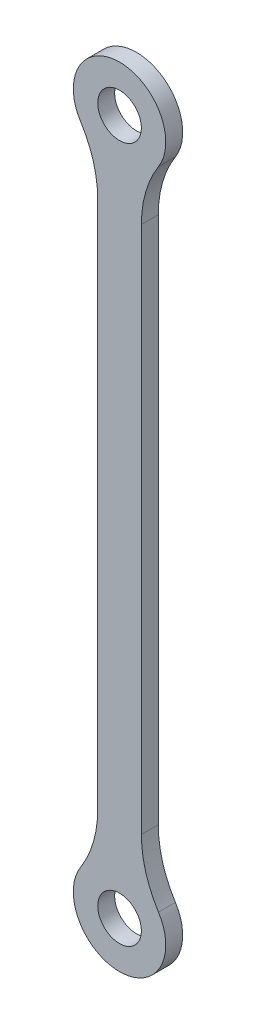
ISO-10303-21;
HEADER;
FILE_DESCRIPTION(('STEP AP214'),'2;1');
FILE_NAME('part.step','',(''),(''),'','','');
FILE_SCHEMA(('AUTOMOTIVE_DESIGN { 1 0 10303 214 1 1 1 1 }'));
ENDSEC;
DATA;
#1=APPLICATION_CONTEXT('core data for automotive mechanical design processes');
#2=APPLICATION_PROTOCOL_DEFINITION('international standard','automotive_design',2000,#1);
#3=PRODUCT_CONTEXT('',#1,'mechanical');
#4=PRODUCT('Part','Part','',(#3));
#5=PRODUCT_RELATED_PRODUCT_CATEGORY('part','',(#4));
#6=PRODUCT_DEFINITION_FORMATION('','',#4);
#7=PRODUCT_DEFINITION_CONTEXT('part definition',#1,'design');
#8=PRODUCT_DEFINITION('design','',#6,#7);
#9=PRODUCT_DEFINITION_SHAPE('','',#8);
#10=(LENGTH_UNIT() NAMED_UNIT(*) SI_UNIT(.MILLI.,.METRE.));
#11=(NAMED_UNIT(*) PLANE_ANGLE_UNIT() SI_UNIT($,.RADIAN.));
#12=(NAMED_UNIT(*) SI_UNIT($,.STERADIAN.) SOLID_ANGLE_UNIT());
#13=UNCERTAINTY_MEASURE_WITH_UNIT(LENGTH_MEASURE(1.E-05),#10,'distance_accuracy_value','');
#14=(GEOMETRIC_REPRESENTATION_CONTEXT(3) GLOBAL_UNCERTAINTY_ASSIGNED_CONTEXT((#13)) GLOBAL_UNIT_ASSIGNED_CONTEXT((#10,
#11,#12)) REPRESENTATION_CONTEXT('',''));
#15=CARTESIAN_POINT('',(0.,0.,0.));
#16=DIRECTION('',(0.,0.,1.));
#17=DIRECTION('',(1.,0.,0.));
#18=AXIS2_PLACEMENT_3D('',#15,#16,#17);
#19=CARTESIAN_POINT('',(0.,-127.5,6.2));
#20=DIRECTION('',(0.,0.,-1.));
#21=DIRECTION('',(-1.,0.,0.));
#22=AXIS2_PLACEMENT_3D('',#19,#20,#21);
#23=CYLINDRICAL_SURFACE('',#22,16.95);
#24=CARTESIAN_POINT('',(0.,-127.5,0.));
#25=DIRECTION('',(0.,0.,1.));
#26=DIRECTION('',(1.,0.,0.));
#27=AXIS2_PLACEMENT_3D('',#24,#25,#26);
#28=CIRCLE('',#27,16.95);
#29=CARTESIAN_POINT('',(-14.2862159789289,-118.378238492298,0.));
#30=VERTEX_POINT('',#29);
#31=CARTESIAN_POINT('',(14.2862159789289,-118.378238492298,0.));
#32=VERTEX_POINT('',#31);
#33=EDGE_CURVE('E142',#30,#32,#28,.T.);
#34=ORIENTED_EDGE('',*,*,#33,.T.);
#35=DIRECTION('',(0.,0.,-1.));
#36=VECTOR('',#35,1.);
#37=CARTESIAN_POINT('',(14.2862159789289,-118.378238492298,6.2));
#38=LINE('',#37,#36);
#39=CARTESIAN_POINT('',(14.2862159789289,-118.378238492298,6.2));
#40=VERTEX_POINT('',#39);
#41=EDGE_CURVE('E11',#40,#32,#38,.T.);
#42=ORIENTED_EDGE('',*,*,#41,.F.);
#43=CARTESIAN_POINT('',(0.,-127.5,6.2));
#44=DIRECTION('',(0.,0.,1.));
#45=DIRECTION('',(1.,0.,0.));
#46=AXIS2_PLACEMENT_3D('',#43,#44,#45);
#47=CIRCLE('',#46,16.95);
#48=CARTESIAN_POINT('',(-14.2862159789289,-118.378238492298,6.2));
#49=VERTEX_POINT('',#48);
#50=EDGE_CURVE('E184',#49,#40,#47,.T.);
#51=ORIENTED_EDGE('',*,*,#50,.F.);
#52=DIRECTION('',(0.,0.,-1.));
#53=VECTOR('',#52,1.);
#54=CARTESIAN_POINT('',(-14.2862159789289,-118.378238492298,6.2));
#55=LINE('',#54,#53);
#56=EDGE_CURVE('E135',#49,#30,#55,.T.);
#57=ORIENTED_EDGE('',*,*,#56,.T.);
#58=EDGE_LOOP('',(#34,#42,#51,#57));
#59=FACE_BOUND('',#58,.T.);
#60=ADVANCED_FACE('F37',(#59),#23,.T.);
#61=CARTESIAN_POINT('',(48.,-96.851957648163,6.2));
#62=DIRECTION('',(0.,0.,-1.));
#63=DIRECTION('',(-1.,0.,0.));
#64=AXIS2_PLACEMENT_3D('',#61,#62,#63);
#65=CYLINDRICAL_SURFACE('',#64,40.);
#66=CARTESIAN_POINT('',(48.,-96.851957648163,0.));
#67=DIRECTION('',(0.,0.,1.));
#68=DIRECTION('',(1.,0.,0.));
#69=AXIS2_PLACEMENT_3D('',#66,#67,#68);
#70=CIRCLE('',#69,40.);
#71=CARTESIAN_POINT('',(8.00000000000003,-96.8519576481629,0.));
#72=VERTEX_POINT('',#71);
#73=EDGE_CURVE('E145',#32,#72,#70,.F.);
#74=ORIENTED_EDGE('',*,*,#73,.T.);
#75=DIRECTION('',(0.,0.,-1.));
#76=VECTOR('',#75,1.);
#77=CARTESIAN_POINT('',(8.00000000000003,-96.8519576481629,6.2));
#78=LINE('',#77,#76);
#79=CARTESIAN_POINT('',(8.00000000000003,-96.8519576481629,6.2));
#80=VERTEX_POINT('',#79);
#81=EDGE_CURVE('E46',#80,#72,#78,.T.);
#82=ORIENTED_EDGE('',*,*,#81,.F.);
#83=CARTESIAN_POINT('',(48.,-96.851957648163,6.2));
#84=DIRECTION('',(0.,0.,1.));
#85=DIRECTION('',(1.,0.,0.));
#86=AXIS2_PLACEMENT_3D('',#83,#84,#85);
#87=CIRCLE('',#86,40.);
#88=EDGE_CURVE('E96',#40,#80,#87,.F.);
#89=ORIENTED_EDGE('',*,*,#88,.F.);
#90=ORIENTED_EDGE('',*,*,#41,.T.);
#91=EDGE_LOOP('',(#74,#82,#89,#90));
#92=FACE_BOUND('',#91,.T.);
#93=ADVANCED_FACE('F173',(#92),#65,.F.);
#94=CARTESIAN_POINT('',(8.00000000000002,0.,6.2));
#95=DIRECTION('',(1.,0.,0.));
#96=DIRECTION('',(0.,1.,0.));
#97=AXIS2_PLACEMENT_3D('',#94,#95,#96);
#98=PLANE('',#97);
#99=DIRECTION('',(0.,-1.,0.));
#100=VECTOR('',#99,1.);
#101=CARTESIAN_POINT('',(8.00000000000002,0.,0.));
#102=LINE('',#101,#100);
#103=CARTESIAN_POINT('',(8.00000000000001,96.851957648163,0.));
#104=VERTEX_POINT('',#103);
#105=EDGE_CURVE('E148',#104,#72,#102,.T.);
#106=ORIENTED_EDGE('',*,*,#105,.F.);
#107=DIRECTION('',(0.,0.,-1.));
#108=VECTOR('',#107,1.);
#109=CARTESIAN_POINT('',(8.00000000000001,96.851957648163,6.2));
#110=LINE('',#109,#108);
#111=CARTESIAN_POINT('',(8.00000000000001,96.851957648163,6.2));
#112=VERTEX_POINT('',#111);
#113=EDGE_CURVE('E166',#112,#104,#110,.T.);
#114=ORIENTED_EDGE('',*,*,#113,.F.);
#115=DIRECTION('',(0.,-1.,0.));
#116=VECTOR('',#115,1.);
#117=CARTESIAN_POINT('',(8.00000000000002,0.,6.2));
#118=LINE('',#117,#116);
#119=EDGE_CURVE('E172',#112,#80,#118,.T.);
#120=ORIENTED_EDGE('',*,*,#119,.T.);
#121=ORIENTED_EDGE('',*,*,#81,.T.);
#122=EDGE_LOOP('',(#106,#114,#120,#121));
#123=FACE_BOUND('',#122,.T.);
#124=ADVANCED_FACE('F170',(#123),#98,.T.);
#125=CARTESIAN_POINT('',(48.,96.851957648163,6.2));
#126=DIRECTION('',(0.,0.,-1.));
#127=DIRECTION('',(-1.,0.,0.));
#128=AXIS2_PLACEMENT_3D('',#125,#126,#127);
#129=CYLINDRICAL_SURFACE('',#128,40.);
#130=CARTESIAN_POINT('',(48.,96.851957648163,0.));
#131=DIRECTION('',(0.,0.,1.));
#132=DIRECTION('',(1.,0.,0.));
#133=AXIS2_PLACEMENT_3D('',#130,#131,#132);
#134=CIRCLE('',#133,40.);
#135=CARTESIAN_POINT('',(14.2862159789289,118.378238492298,0.));
#136=VERTEX_POINT('',#135);
#137=EDGE_CURVE('E151',#136,#104,#134,.T.);
#138=ORIENTED_EDGE('',*,*,#137,.F.);
#139=DIRECTION('',(0.,0.,-1.));
#140=VECTOR('',#139,1.);
#141=CARTESIAN_POINT('',(14.2862159789289,118.378238492298,6.2));
#142=LINE('',#141,#140);
#143=CARTESIAN_POINT('',(14.2862159789289,118.378238492298,6.2));
#144=VERTEX_POINT('',#143);
#145=EDGE_CURVE('E164',#144,#136,#142,.T.);
#146=ORIENTED_EDGE('',*,*,#145,.F.);
#147=CARTESIAN_POINT('',(48.,96.851957648163,6.2));
#148=DIRECTION('',(0.,0.,1.));
#149=DIRECTION('',(1.,0.,0.));
#150=AXIS2_PLACEMENT_3D('',#147,#148,#149);
#151=CIRCLE('',#150,40.);
#152=EDGE_CURVE('E130',#144,#112,#151,.T.);
#153=ORIENTED_EDGE('',*,*,#152,.T.);
#154=ORIENTED_EDGE('',*,*,#113,.T.);
#155=EDGE_LOOP('',(#138,#146,#153,#154));
#156=FACE_BOUND('',#155,.T.);
#157=ADVANCED_FACE('F181',(#156),#129,.F.);
#158=CARTESIAN_POINT('',(0.,127.5,6.2));
#159=DIRECTION('',(0.,0.,-1.));
#160=DIRECTION('',(-1.,0.,0.));
#161=AXIS2_PLACEMENT_3D('',#158,#159,#160);
#162=CYLINDRICAL_SURFACE('',#161,16.95);
#163=CARTESIAN_POINT('',(0.,127.5,0.));
#164=DIRECTION('',(0.,0.,1.));
#165=DIRECTION('',(1.,0.,0.));
#166=AXIS2_PLACEMENT_3D('',#163,#164,#165);
#167=CIRCLE('',#166,16.95);
#168=CARTESIAN_POINT('',(-14.2862159789289,118.378238492298,0.));
#169=VERTEX_POINT('',#168);
#170=EDGE_CURVE('E154',#136,#169,#167,.T.);
#171=ORIENTED_EDGE('',*,*,#170,.T.);
#172=DIRECTION('',(0.,0.,-1.));
#173=VECTOR('',#172,1.);
#174=CARTESIAN_POINT('',(-14.2862159789289,118.378238492298,6.2));
#175=LINE('',#174,#173);
#176=CARTESIAN_POINT('',(-14.2862159789289,118.378238492298,6.2));
#177=VERTEX_POINT('',#176);
#178=EDGE_CURVE('E118',#177,#169,#175,.T.);
#179=ORIENTED_EDGE('',*,*,#178,.F.);
#180=CARTESIAN_POINT('',(0.,127.5,6.2));
#181=DIRECTION('',(0.,0.,1.));
#182=DIRECTION('',(1.,0.,0.));
#183=AXIS2_PLACEMENT_3D('',#180,#181,#182);
#184=CIRCLE('',#183,16.95);
#185=EDGE_CURVE('E127',#144,#177,#184,.T.);
#186=ORIENTED_EDGE('',*,*,#185,.F.);
#187=ORIENTED_EDGE('',*,*,#145,.T.);
#188=EDGE_LOOP('',(#171,#179,#186,#187));
#189=FACE_BOUND('',#188,.T.);
#190=ADVANCED_FACE('F225',(#189),#162,.T.);
#191=CARTESIAN_POINT('',(-48.,96.8519576481628,6.2));
#192=DIRECTION('',(0.,0.,-1.));
#193=DIRECTION('',(-1.,0.,0.));
#194=AXIS2_PLACEMENT_3D('',#191,#192,#193);
#195=CYLINDRICAL_SURFACE('',#194,40.);
#196=CARTESIAN_POINT('',(-48.,96.8519576481628,0.));
#197=DIRECTION('',(0.,0.,1.));
#198=DIRECTION('',(1.,0.,0.));
#199=AXIS2_PLACEMENT_3D('',#196,#197,#198);
#200=CIRCLE('',#199,40.);
#201=CARTESIAN_POINT('',(-8.,96.8519576481628,0.));
#202=VERTEX_POINT('',#201);
#203=EDGE_CURVE('E117',#202,#169,#200,.T.);
#204=ORIENTED_EDGE('',*,*,#203,.F.);
#205=DIRECTION('',(0.,0.,-1.));
#206=VECTOR('',#205,1.);
#207=CARTESIAN_POINT('',(-8.,96.8519576481628,6.2));
#208=LINE('',#207,#206);
#209=CARTESIAN_POINT('',(-8.,96.8519576481628,6.2));
#210=VERTEX_POINT('',#209);
#211=EDGE_CURVE('E111',#210,#202,#208,.T.);
#212=ORIENTED_EDGE('',*,*,#211,.F.);
#213=CARTESIAN_POINT('',(-48.,96.8519576481628,6.2));
#214=DIRECTION('',(0.,0.,1.));
#215=DIRECTION('',(1.,0.,0.));
#216=AXIS2_PLACEMENT_3D('',#213,#214,#215);
#217=CIRCLE('',#216,40.);
#218=EDGE_CURVE('E115',#210,#177,#217,.T.);
#219=ORIENTED_EDGE('',*,*,#218,.T.);
#220=ORIENTED_EDGE('',*,*,#178,.T.);
#221=EDGE_LOOP('',(#204,#212,#219,#220));
#222=FACE_BOUND('',#221,.T.);
#223=ADVANCED_FACE('F113',(#222),#195,.F.);
#224=CARTESIAN_POINT('',(-7.99999999999999,0.,6.2));
#225=DIRECTION('',(1.,0.,0.));
#226=DIRECTION('',(0.,1.,0.));
#227=AXIS2_PLACEMENT_3D('',#224,#225,#226);
#228=PLANE('',#227);
#229=DIRECTION('',(0.,-1.,0.));
#230=VECTOR('',#229,1.);
#231=CARTESIAN_POINT('',(-7.99999999999999,0.,0.));
#232=LINE('',#231,#230);
#233=CARTESIAN_POINT('',(-7.99999999999997,-96.851957648163,0.));
#234=VERTEX_POINT('',#233);
#235=EDGE_CURVE('E82',#202,#234,#232,.T.);
#236=ORIENTED_EDGE('',*,*,#235,.T.);
#237=DIRECTION('',(0.,0.,-1.));
#238=VECTOR('',#237,1.);
#239=CARTESIAN_POINT('',(-7.99999999999997,-96.851957648163,6.2));
#240=LINE('',#239,#238);
#241=CARTESIAN_POINT('',(-7.99999999999997,-96.851957648163,6.2));
#242=VERTEX_POINT('',#241);
#243=EDGE_CURVE('E119',#242,#234,#240,.T.);
#244=ORIENTED_EDGE('',*,*,#243,.F.);
#245=DIRECTION('',(0.,-1.,0.));
#246=VECTOR('',#245,1.);
#247=CARTESIAN_POINT('',(-7.99999999999999,0.,6.2));
#248=LINE('',#247,#246);
#249=EDGE_CURVE('E121',#210,#242,#248,.T.);
#250=ORIENTED_EDGE('',*,*,#249,.F.);
#251=ORIENTED_EDGE('',*,*,#211,.T.);
#252=EDGE_LOOP('',(#236,#244,#250,#251));
#253=FACE_BOUND('',#252,.T.);
#254=ADVANCED_FACE('F122',(#253),#228,.F.);
#255=CARTESIAN_POINT('',(0.,-127.5,6.2));
#256=DIRECTION('',(0.,0.,-1.));
#257=DIRECTION('',(-1.,0.,0.));
#258=AXIS2_PLACEMENT_3D('',#255,#256,#257);
#259=CYLINDRICAL_SURFACE('',#258,8.);
#260=CARTESIAN_POINT('',(0.,-127.5,6.2));
#261=DIRECTION('',(0.,0.,1.));
#262=DIRECTION('',(1.,0.,0.));
#263=AXIS2_PLACEMENT_3D('',#260,#261,#262);
#264=CIRCLE('',#263,8.);
#265=CARTESIAN_POINT('',(-7.99999999999997,-127.5,6.2));
#266=VERTEX_POINT('',#265);
#267=EDGE_CURVE('E188',#266,#266,#264,.T.);
#268=CARTESIAN_POINT('',(0.,-127.5,0.));
#269=DIRECTION('',(0.,0.,1.));
#270=DIRECTION('',(1.,0.,0.));
#271=AXIS2_PLACEMENT_3D('',#268,#269,#270);
#272=CIRCLE('',#271,8.);
#273=CARTESIAN_POINT('',(-7.99999999999997,-127.5,0.));
#274=VERTEX_POINT('',#273);
#275=EDGE_CURVE('E139',#274,#274,#272,.T.);
#276=CARTESIAN_POINT('',(-7.99999999999997,-127.5,6.2));
#277=CARTESIAN_POINT('',(-7.99999999999997,-127.5,6.13541666666667));
#278=CARTESIAN_POINT('',(-7.99999999999997,-127.5,6.07083333333333));
#279=CARTESIAN_POINT('',(-7.99999999999997,-127.5,5.94166666666667));
#280=CARTESIAN_POINT('',(-7.99999999999997,-127.5,5.87708333333333));
#281=CARTESIAN_POINT('',(-7.99999999999997,-127.5,5.74791666666667));
#282=CARTESIAN_POINT('',(-7.99999999999997,-127.5,5.68333333333333));
#283=CARTESIAN_POINT('',(-7.99999999999997,-127.5,5.55416666666667));
#284=CARTESIAN_POINT('',(-7.99999999999997,-127.5,5.48958333333333));
#285=CARTESIAN_POINT('',(-7.99999999999997,-127.5,5.36041666666667));
#286=CARTESIAN_POINT('',(-7.99999999999997,-127.5,5.29583333333333));
#287=CARTESIAN_POINT('',(-7.99999999999997,-127.5,5.16666666666667));
#288=CARTESIAN_POINT('',(-7.99999999999997,-127.5,5.10208333333333));
#289=CARTESIAN_POINT('',(-7.99999999999997,-127.5,4.97291666666667));
#290=CARTESIAN_POINT('',(-7.99999999999997,-127.5,4.90833333333333));
#291=CARTESIAN_POINT('',(-7.99999999999997,-127.5,4.77916666666667));
#292=CARTESIAN_POINT('',(-7.99999999999997,-127.5,4.71458333333333));
#293=CARTESIAN_POINT('',(-7.99999999999997,-127.5,4.58541666666667));
#294=CARTESIAN_POINT('',(-7.99999999999997,-127.5,4.52083333333333));
#295=CARTESIAN_POINT('',(-7.99999999999997,-127.5,4.39166666666667));
#296=CARTESIAN_POINT('',(-7.99999999999997,-127.5,4.32708333333333));
#297=CARTESIAN_POINT('',(-7.99999999999997,-127.5,4.19791666666667));
#298=CARTESIAN_POINT('',(-7.99999999999997,-127.5,4.13333333333333));
#299=CARTESIAN_POINT('',(-7.99999999999997,-127.5,4.00416666666667));
#300=CARTESIAN_POINT('',(-7.99999999999997,-127.5,3.93958333333333));
#301=CARTESIAN_POINT('',(-7.99999999999997,-127.5,3.81041666666667));
#302=CARTESIAN_POINT('',(-7.99999999999997,-127.5,3.74583333333333));
#303=CARTESIAN_POINT('',(-7.99999999999997,-127.5,3.61666666666667));
#304=CARTESIAN_POINT('',(-7.99999999999997,-127.5,3.55208333333333));
#305=CARTESIAN_POINT('',(-7.99999999999997,-127.5,3.42291666666667));
#306=CARTESIAN_POINT('',(-7.99999999999997,-127.5,3.35833333333333));
#307=CARTESIAN_POINT('',(-7.99999999999997,-127.5,3.22916666666667));
#308=CARTESIAN_POINT('',(-7.99999999999997,-127.5,3.16458333333333));
#309=CARTESIAN_POINT('',(-7.99999999999997,-127.5,3.03541666666667));
#310=CARTESIAN_POINT('',(-7.99999999999997,-127.5,2.97083333333333));
#311=CARTESIAN_POINT('',(-7.99999999999997,-127.5,2.84166666666667));
#312=CARTESIAN_POINT('',(-7.99999999999997,-127.5,2.77708333333333));
#313=CARTESIAN_POINT('',(-7.99999999999997,-127.5,2.64791666666667));
#314=CARTESIAN_POINT('',(-7.99999999999997,-127.5,2.58333333333333));
#315=CARTESIAN_POINT('',(-7.99999999999997,-127.5,2.45416666666667));
#316=CARTESIAN_POINT('',(-7.99999999999997,-127.5,2.38958333333333));
#317=CARTESIAN_POINT('',(-7.99999999999997,-127.5,2.26041666666667));
#318=CARTESIAN_POINT('',(-7.99999999999997,-127.5,2.19583333333333));
#319=CARTESIAN_POINT('',(-7.99999999999997,-127.5,2.06666666666667));
#320=CARTESIAN_POINT('',(-7.99999999999997,-127.5,2.00208333333333));
#321=CARTESIAN_POINT('',(-7.99999999999997,-127.5,1.87291666666667));
#322=CARTESIAN_POINT('',(-7.99999999999997,-127.5,1.80833333333333));
#323=CARTESIAN_POINT('',(-7.99999999999997,-127.5,1.67916666666667));
#324=CARTESIAN_POINT('',(-7.99999999999997,-127.5,1.61458333333333));
#325=CARTESIAN_POINT('',(-7.99999999999997,-127.5,1.48541666666667));
#326=CARTESIAN_POINT('',(-7.99999999999997,-127.5,1.42083333333333));
#327=CARTESIAN_POINT('',(-7.99999999999997,-127.5,1.29166666666667));
#328=CARTESIAN_POINT('',(-7.99999999999997,-127.5,1.22708333333333));
#329=CARTESIAN_POINT('',(-7.99999999999997,-127.5,1.09791666666667));
#330=CARTESIAN_POINT('',(-7.99999999999997,-127.5,1.03333333333333));
#331=CARTESIAN_POINT('',(-7.99999999999997,-127.5,0.904166666666667));
#332=CARTESIAN_POINT('',(-7.99999999999997,-127.5,0.839583333333333));
#333=CARTESIAN_POINT('',(-7.99999999999997,-127.5,0.710416666666666));
#334=CARTESIAN_POINT('',(-7.99999999999997,-127.5,0.645833333333333));
#335=CARTESIAN_POINT('',(-7.99999999999997,-127.5,0.516666666666667));
#336=CARTESIAN_POINT('',(-7.99999999999997,-127.5,0.452083333333333));
#337=CARTESIAN_POINT('',(-7.99999999999997,-127.5,0.322916666666667));
#338=CARTESIAN_POINT('',(-7.99999999999997,-127.5,0.258333333333334));
#339=CARTESIAN_POINT('',(-7.99999999999997,-127.5,0.129166666666667));
#340=CARTESIAN_POINT('',(-7.99999999999997,-127.5,0.0645833333333335));
#341=CARTESIAN_POINT('',(-7.99999999999997,-127.5,0.));
#342=B_SPLINE_CURVE_WITH_KNOTS('',3,(#276,#277,#278,#279,#280,#281,#282,#283,#284,#285,#286,
#287,#288,#289,#290,#291,#292,#293,#294,#295,#296,#297,#298,#299,#300,#301,#302,#303,#304,#305,
#306,#307,#308,#309,#310,#311,#312,#313,#314,#315,#316,#317,#318,#319,#320,#321,#322,#323,#324,
#325,#326,#327,#328,#329,#330,#331,#332,#333,#334,#335,#336,#337,#338,#339,#340,#341),
.UNSPECIFIED.,.F.,.F.,(4,2,2,2,2,2,2,2,2,2,2,2,2,2,2,2,2,2,2,2,2,2,2,2,2,2,2,2,2,2,2,2,4),(0.,
0.193749999999999,0.3875,0.581249999999999,0.775,0.968749999999999,1.1625,1.35625,1.55,1.74375,
1.9375,2.13125,2.325,2.51875,2.7125,2.90625,3.1,3.29375,3.4875,3.68125,3.875,4.06875,4.2625,
4.45625,4.65,4.84375,5.0375,5.23125,5.425,5.61875,5.8125,6.00625,6.2),.UNSPECIFIED.);
#343=EDGE_CURVE('BSEAM202',#266,#274,#342,.T.);
#344=ORIENTED_EDGE('',*,*,#267,.T.);
#345=ORIENTED_EDGE('',*,*,#275,.F.);
#346=ORIENTED_EDGE('',*,*,#343,.T.);
#347=ORIENTED_EDGE('',*,*,#343,.F.);
#348=EDGE_LOOP('',(#344,#346,#345,#347));
#349=FACE_BOUND('',#348,.T.);
#350=ADVANCED_FACE('F202',(#349),#259,.F.);
#351=CARTESIAN_POINT('',(0.,127.5,6.2));
#352=DIRECTION('',(0.,0.,-1.));
#353=DIRECTION('',(-1.,0.,0.));
#354=AXIS2_PLACEMENT_3D('',#351,#352,#353);
#355=CYLINDRICAL_SURFACE('',#354,8.);
#356=CARTESIAN_POINT('',(0.,127.5,6.2));
#357=DIRECTION('',(0.,0.,1.));
#358=DIRECTION('',(1.,0.,0.));
#359=AXIS2_PLACEMENT_3D('',#356,#357,#358);
#360=CIRCLE('',#359,8.);
#361=CARTESIAN_POINT('',(-8.00000000000005,127.5,6.2));
#362=VERTEX_POINT('',#361);
#363=EDGE_CURVE('E160',#362,#362,#360,.T.);
#364=CARTESIAN_POINT('',(0.,127.5,0.));
#365=DIRECTION('',(0.,0.,1.));
#366=DIRECTION('',(1.,0.,0.));
#367=AXIS2_PLACEMENT_3D('',#364,#365,#366);
#368=CIRCLE('',#367,8.);
#369=CARTESIAN_POINT('',(-8.00000000000005,127.5,0.));
#370=VERTEX_POINT('',#369);
#371=EDGE_CURVE('E136',#370,#370,#368,.T.);
#372=CARTESIAN_POINT('',(-8.00000000000005,127.5,6.2));
#373=CARTESIAN_POINT('',(-8.00000000000005,127.5,6.13541666666667));
#374=CARTESIAN_POINT('',(-8.00000000000005,127.5,6.07083333333333));
#375=CARTESIAN_POINT('',(-8.00000000000005,127.5,5.94166666666667));
#376=CARTESIAN_POINT('',(-8.00000000000005,127.5,5.87708333333333));
#377=CARTESIAN_POINT('',(-8.00000000000005,127.5,5.74791666666667));
#378=CARTESIAN_POINT('',(-8.00000000000005,127.5,5.68333333333333));
#379=CARTESIAN_POINT('',(-8.00000000000005,127.5,5.55416666666667));
#380=CARTESIAN_POINT('',(-8.00000000000005,127.5,5.48958333333333));
#381=CARTESIAN_POINT('',(-8.00000000000005,127.5,5.36041666666667));
#382=CARTESIAN_POINT('',(-8.00000000000005,127.5,5.29583333333333));
#383=CARTESIAN_POINT('',(-8.00000000000005,127.5,5.16666666666667));
#384=CARTESIAN_POINT('',(-8.00000000000005,127.5,5.10208333333333));
#385=CARTESIAN_POINT('',(-8.00000000000005,127.5,4.97291666666667));
#386=CARTESIAN_POINT('',(-8.00000000000005,127.5,4.90833333333333));
#387=CARTESIAN_POINT('',(-8.00000000000005,127.5,4.77916666666667));
#388=CARTESIAN_POINT('',(-8.00000000000005,127.5,4.71458333333333));
#389=CARTESIAN_POINT('',(-8.00000000000005,127.5,4.58541666666667));
#390=CARTESIAN_POINT('',(-8.00000000000005,127.5,4.52083333333333));
#391=CARTESIAN_POINT('',(-8.00000000000005,127.5,4.39166666666667));
#392=CARTESIAN_POINT('',(-8.00000000000005,127.5,4.32708333333333));
#393=CARTESIAN_POINT('',(-8.00000000000005,127.5,4.19791666666667));
#394=CARTESIAN_POINT('',(-8.00000000000005,127.5,4.13333333333333));
#395=CARTESIAN_POINT('',(-8.00000000000005,127.5,4.00416666666667));
#396=CARTESIAN_POINT('',(-8.00000000000005,127.5,3.93958333333333));
#397=CARTESIAN_POINT('',(-8.00000000000005,127.5,3.81041666666667));
#398=CARTESIAN_POINT('',(-8.00000000000005,127.5,3.74583333333333));
#399=CARTESIAN_POINT('',(-8.00000000000005,127.5,3.61666666666667));
#400=CARTESIAN_POINT('',(-8.00000000000005,127.5,3.55208333333333));
#401=CARTESIAN_POINT('',(-8.00000000000005,127.5,3.42291666666667));
#402=CARTESIAN_POINT('',(-8.00000000000005,127.5,3.35833333333333));
#403=CARTESIAN_POINT('',(-8.00000000000005,127.5,3.22916666666667));
#404=CARTESIAN_POINT('',(-8.00000000000005,127.5,3.16458333333333));
#405=CARTESIAN_POINT('',(-8.00000000000005,127.5,3.03541666666667));
#406=CARTESIAN_POINT('',(-8.00000000000005,127.5,2.97083333333333));
#407=CARTESIAN_POINT('',(-8.00000000000005,127.5,2.84166666666667));
#408=CARTESIAN_POINT('',(-8.00000000000005,127.5,2.77708333333333));
#409=CARTESIAN_POINT('',(-8.00000000000005,127.5,2.64791666666667));
#410=CARTESIAN_POINT('',(-8.00000000000005,127.5,2.58333333333333));
#411=CARTESIAN_POINT('',(-8.00000000000005,127.5,2.45416666666667));
#412=CARTESIAN_POINT('',(-8.00000000000005,127.5,2.38958333333333));
#413=CARTESIAN_POINT('',(-8.00000000000005,127.5,2.26041666666667));
#414=CARTESIAN_POINT('',(-8.00000000000005,127.5,2.19583333333333));
#415=CARTESIAN_POINT('',(-8.00000000000005,127.5,2.06666666666667));
#416=CARTESIAN_POINT('',(-8.00000000000005,127.5,2.00208333333333));
#417=CARTESIAN_POINT('',(-8.00000000000005,127.5,1.87291666666667));
#418=CARTESIAN_POINT('',(-8.00000000000005,127.5,1.80833333333333));
#419=CARTESIAN_POINT('',(-8.00000000000005,127.5,1.67916666666667));
#420=CARTESIAN_POINT('',(-8.00000000000005,127.5,1.61458333333333));
#421=CARTESIAN_POINT('',(-8.00000000000005,127.5,1.48541666666667));
#422=CARTESIAN_POINT('',(-8.00000000000005,127.5,1.42083333333333));
#423=CARTESIAN_POINT('',(-8.00000000000005,127.5,1.29166666666667));
#424=CARTESIAN_POINT('',(-8.00000000000005,127.5,1.22708333333333));
#425=CARTESIAN_POINT('',(-8.00000000000005,127.5,1.09791666666667));
#426=CARTESIAN_POINT('',(-8.00000000000005,127.5,1.03333333333333));
#427=CARTESIAN_POINT('',(-8.00000000000005,127.5,0.904166666666667));
#428=CARTESIAN_POINT('',(-8.00000000000005,127.5,0.839583333333333));
#429=CARTESIAN_POINT('',(-8.00000000000005,127.5,0.710416666666666));
#430=CARTESIAN_POINT('',(-8.00000000000005,127.5,0.645833333333333));
#431=CARTESIAN_POINT('',(-8.00000000000005,127.5,0.516666666666667));
#432=CARTESIAN_POINT('',(-8.00000000000005,127.5,0.452083333333333));
#433=CARTESIAN_POINT('',(-8.00000000000005,127.5,0.322916666666667));
#434=CARTESIAN_POINT('',(-8.00000000000005,127.5,0.258333333333334));
#435=CARTESIAN_POINT('',(-8.00000000000005,127.5,0.129166666666667));
#436=CARTESIAN_POINT('',(-8.00000000000005,127.5,0.0645833333333335));
#437=CARTESIAN_POINT('',(-8.00000000000005,127.5,0.));
#438=B_SPLINE_CURVE_WITH_KNOTS('',3,(#372,#373,#374,#375,#376,#377,#378,#379,#380,#381,#382,
#383,#384,#385,#386,#387,#388,#389,#390,#391,#392,#393,#394,#395,#396,#397,#398,#399,#400,#401,
#402,#403,#404,#405,#406,#407,#408,#409,#410,#411,#412,#413,#414,#415,#416,#417,#418,#419,#420,
#421,#422,#423,#424,#425,#426,#427,#428,#429,#430,#431,#432,#433,#434,#435,#436,#437),
.UNSPECIFIED.,.F.,.F.,(4,2,2,2,2,2,2,2,2,2,2,2,2,2,2,2,2,2,2,2,2,2,2,2,2,2,2,2,2,2,2,2,4),(0.,
0.193749999999999,0.3875,0.581249999999999,0.775,0.968749999999999,1.1625,1.35625,1.55,1.74375,
1.9375,2.13125,2.325,2.51875,2.7125,2.90625,3.1,3.29375,3.4875,3.68125,3.875,4.06875,4.2625,
4.45625,4.65,4.84375,5.0375,5.23125,5.425,5.61875,5.8125,6.00625,6.2),.UNSPECIFIED.);
#439=EDGE_CURVE('BSEAM39',#362,#370,#438,.T.);
#440=ORIENTED_EDGE('',*,*,#363,.T.);
#441=ORIENTED_EDGE('',*,*,#371,.F.);
#442=ORIENTED_EDGE('',*,*,#439,.T.);
#443=ORIENTED_EDGE('',*,*,#439,.F.);
#444=EDGE_LOOP('',(#440,#442,#441,#443));
#445=FACE_BOUND('',#444,.T.);
#446=ADVANCED_FACE('F39',(#445),#355,.F.);
#447=CARTESIAN_POINT('',(-48.,-96.8519576481628,6.2));
#448=DIRECTION('',(0.,0.,-1.));
#449=DIRECTION('',(-1.,0.,0.));
#450=AXIS2_PLACEMENT_3D('',#447,#448,#449);
#451=CYLINDRICAL_SURFACE('',#450,40.);
#452=CARTESIAN_POINT('',(-48.,-96.8519576481628,0.));
#453=DIRECTION('',(0.,0.,1.));
#454=DIRECTION('',(1.,0.,0.));
#455=AXIS2_PLACEMENT_3D('',#452,#453,#454);
#456=CIRCLE('',#455,40.);
#457=EDGE_CURVE('E88',#234,#30,#456,.F.);
#458=ORIENTED_EDGE('',*,*,#457,.T.);
#459=ORIENTED_EDGE('',*,*,#56,.F.);
#460=CARTESIAN_POINT('',(-48.,-96.8519576481628,6.2));
#461=DIRECTION('',(0.,0.,1.));
#462=DIRECTION('',(1.,0.,0.));
#463=AXIS2_PLACEMENT_3D('',#460,#461,#462);
#464=CIRCLE('',#463,40.);
#465=EDGE_CURVE('E54',#242,#49,#464,.F.);
#466=ORIENTED_EDGE('',*,*,#465,.F.);
#467=ORIENTED_EDGE('',*,*,#243,.T.);
#468=EDGE_LOOP('',(#458,#459,#466,#467));
#469=FACE_BOUND('',#468,.T.);
#470=ADVANCED_FACE('F198',(#469),#451,.F.);
#471=CARTESIAN_POINT('',(0.,0.,6.2));
#472=DIRECTION('',(0.,0.,1.));
#473=DIRECTION('',(1.,0.,0.));
#474=AXIS2_PLACEMENT_3D('',#471,#472,#473);
#475=PLANE('',#474);
#476=ORIENTED_EDGE('',*,*,#363,.F.);
#477=EDGE_LOOP('',(#476));
#478=FACE_BOUND('',#477,.T.);
#479=ORIENTED_EDGE('',*,*,#267,.F.);
#480=EDGE_LOOP('',(#479));
#481=FACE_BOUND('',#480,.T.);
#482=ORIENTED_EDGE('',*,*,#50,.T.);
#483=ORIENTED_EDGE('',*,*,#88,.T.);
#484=ORIENTED_EDGE('',*,*,#119,.F.);
#485=ORIENTED_EDGE('',*,*,#152,.F.);
#486=ORIENTED_EDGE('',*,*,#185,.T.);
#487=ORIENTED_EDGE('',*,*,#218,.F.);
#488=ORIENTED_EDGE('',*,*,#249,.T.);
#489=ORIENTED_EDGE('',*,*,#465,.T.);
#490=EDGE_LOOP('',(#482,#483,#484,#485,#486,#487,#488,#489));
#491=FACE_BOUND('',#490,.T.);
#492=ADVANCED_FACE('F124',(#478,#481,#491),#475,.T.);
#493=CARTESIAN_POINT('',(0.,0.,0.));
#494=DIRECTION('',(0.,0.,1.));
#495=DIRECTION('',(1.,0.,0.));
#496=AXIS2_PLACEMENT_3D('',#493,#494,#495);
#497=PLANE('',#496);
#498=ORIENTED_EDGE('',*,*,#371,.T.);
#499=EDGE_LOOP('',(#498));
#500=FACE_BOUND('',#499,.T.);
#501=ORIENTED_EDGE('',*,*,#275,.T.);
#502=EDGE_LOOP('',(#501));
#503=FACE_BOUND('',#502,.T.);
#504=ORIENTED_EDGE('',*,*,#33,.F.);
#505=ORIENTED_EDGE('',*,*,#457,.F.);
#506=ORIENTED_EDGE('',*,*,#235,.F.);
#507=ORIENTED_EDGE('',*,*,#203,.T.);
#508=ORIENTED_EDGE('',*,*,#170,.F.);
#509=ORIENTED_EDGE('',*,*,#137,.T.);
#510=ORIENTED_EDGE('',*,*,#105,.T.);
#511=ORIENTED_EDGE('',*,*,#73,.F.);
#512=EDGE_LOOP('',(#504,#505,#506,#507,#508,#509,#510,#511));
#513=FACE_BOUND('',#512,.T.);
#514=ADVANCED_FACE('F177',(#500,#503,#513),#497,.F.);
#515=CLOSED_SHELL('',(#60,#93,#124,#157,#190,#223,#254,#350,#446,#470,#492,#514));
#516=MANIFOLD_SOLID_BREP('B2',#515);
#517=ADVANCED_BREP_SHAPE_REPRESENTATION('',(#18,#516),#14);
#518=SHAPE_DEFINITION_REPRESENTATION(#9,#517);
ENDSEC;
END-ISO-10303-21;
